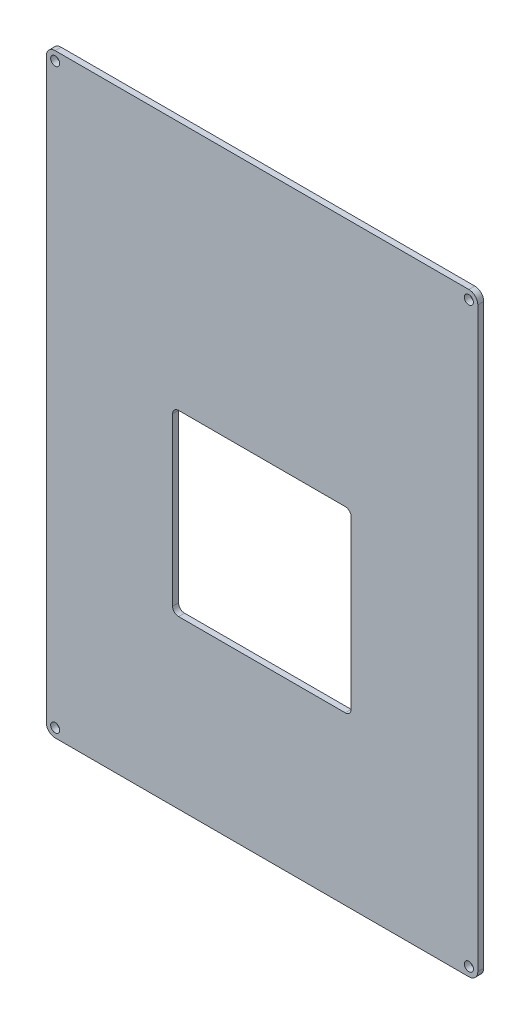
ISO-10303-21;
HEADER;
FILE_DESCRIPTION(('STEP AP214'),'2;1');
FILE_NAME('part.step','',(''),(''),'','','');
FILE_SCHEMA(('AUTOMOTIVE_DESIGN { 1 0 10303 214 1 1 1 1 }'));
ENDSEC;
DATA;
#1=APPLICATION_CONTEXT('core data for automotive mechanical design processes');
#2=APPLICATION_PROTOCOL_DEFINITION('international standard','automotive_design',2000,#1);
#3=PRODUCT_CONTEXT('',#1,'mechanical');
#4=PRODUCT('Part','Part','',(#3));
#5=PRODUCT_RELATED_PRODUCT_CATEGORY('part','',(#4));
#6=PRODUCT_DEFINITION_FORMATION('','',#4);
#7=PRODUCT_DEFINITION_CONTEXT('part definition',#1,'design');
#8=PRODUCT_DEFINITION('design','',#6,#7);
#9=PRODUCT_DEFINITION_SHAPE('','',#8);
#10=(LENGTH_UNIT() NAMED_UNIT(*) SI_UNIT(.MILLI.,.METRE.));
#11=(NAMED_UNIT(*) PLANE_ANGLE_UNIT() SI_UNIT($,.RADIAN.));
#12=(NAMED_UNIT(*) SI_UNIT($,.STERADIAN.) SOLID_ANGLE_UNIT());
#13=UNCERTAINTY_MEASURE_WITH_UNIT(LENGTH_MEASURE(1.E-05),#10,'distance_accuracy_value','');
#14=(GEOMETRIC_REPRESENTATION_CONTEXT(3) GLOBAL_UNCERTAINTY_ASSIGNED_CONTEXT((#13)) GLOBAL_UNIT_ASSIGNED_CONTEXT((#10,
#11,#12)) REPRESENTATION_CONTEXT('',''));
#15=CARTESIAN_POINT('',(0.,0.,0.));
#16=DIRECTION('',(0.,0.,1.));
#17=DIRECTION('',(1.,0.,0.));
#18=AXIS2_PLACEMENT_3D('',#15,#16,#17);
#19=CARTESIAN_POINT('',(-69.5,-94.5,2.));
#20=DIRECTION('',(0.,0.,-1.));
#21=DIRECTION('',(-1.,0.,0.));
#22=AXIS2_PLACEMENT_3D('',#19,#20,#21);
#23=CYLINDRICAL_SURFACE('',#22,3.);
#24=CARTESIAN_POINT('',(-69.5,-94.5,0.));
#25=DIRECTION('',(0.,0.,1.));
#26=DIRECTION('',(-1.,0.,0.));
#27=AXIS2_PLACEMENT_3D('',#24,#25,#26);
#28=CIRCLE('',#27,3.);
#29=CARTESIAN_POINT('',(-72.5,-94.5,0.));
#30=VERTEX_POINT('',#29);
#31=CARTESIAN_POINT('',(-69.5,-97.5,0.));
#32=VERTEX_POINT('',#31);
#33=EDGE_CURVE('E230',#30,#32,#28,.T.);
#34=ORIENTED_EDGE('',*,*,#33,.T.);
#35=DIRECTION('',(0.,0.,-1.));
#36=VECTOR('',#35,1.);
#37=CARTESIAN_POINT('',(-69.5,-97.5,2.));
#38=LINE('',#37,#36);
#39=CARTESIAN_POINT('',(-69.5,-97.5,2.));
#40=VERTEX_POINT('',#39);
#41=EDGE_CURVE('E11',#40,#32,#38,.T.);
#42=ORIENTED_EDGE('',*,*,#41,.F.);
#43=CARTESIAN_POINT('',(-69.5,-94.5,2.));
#44=DIRECTION('',(0.,0.,1.));
#45=DIRECTION('',(-1.,0.,0.));
#46=AXIS2_PLACEMENT_3D('',#43,#44,#45);
#47=CIRCLE('',#46,3.);
#48=CARTESIAN_POINT('',(-72.5,-94.5,2.));
#49=VERTEX_POINT('',#48);
#50=EDGE_CURVE('E231',#49,#40,#47,.T.);
#51=ORIENTED_EDGE('',*,*,#50,.F.);
#52=DIRECTION('',(0.,0.,-1.));
#53=VECTOR('',#52,1.);
#54=CARTESIAN_POINT('',(-72.5,-94.5,2.));
#55=LINE('',#54,#53);
#56=EDGE_CURVE('E254',#49,#30,#55,.T.);
#57=ORIENTED_EDGE('',*,*,#56,.T.);
#58=EDGE_LOOP('',(#34,#42,#51,#57));
#59=FACE_BOUND('',#58,.T.);
#60=ADVANCED_FACE('F39',(#59),#23,.T.);
#61=CARTESIAN_POINT('',(-69.5,-97.5,2.));
#62=DIRECTION('',(0.,1.,0.));
#63=DIRECTION('',(0.,0.,1.));
#64=AXIS2_PLACEMENT_3D('',#61,#62,#63);
#65=PLANE('',#64);
#66=DIRECTION('',(1.,0.,0.));
#67=VECTOR('',#66,1.);
#68=CARTESIAN_POINT('',(-69.5,-97.5,0.));
#69=LINE('',#68,#67);
#70=CARTESIAN_POINT('',(69.5,-97.5,0.));
#71=VERTEX_POINT('',#70);
#72=EDGE_CURVE('E258',#32,#71,#69,.T.);
#73=ORIENTED_EDGE('',*,*,#72,.T.);
#74=DIRECTION('',(0.,0.,-1.));
#75=VECTOR('',#74,1.);
#76=CARTESIAN_POINT('',(69.5,-97.5,2.));
#77=LINE('',#76,#75);
#78=CARTESIAN_POINT('',(69.5,-97.5,2.));
#79=VERTEX_POINT('',#78);
#80=EDGE_CURVE('E48',#79,#71,#77,.T.);
#81=ORIENTED_EDGE('',*,*,#80,.F.);
#82=DIRECTION('',(1.,0.,0.));
#83=VECTOR('',#82,1.);
#84=CARTESIAN_POINT('',(-69.5,-97.5,2.));
#85=LINE('',#84,#83);
#86=EDGE_CURVE('E235',#40,#79,#85,.T.);
#87=ORIENTED_EDGE('',*,*,#86,.F.);
#88=ORIENTED_EDGE('',*,*,#41,.T.);
#89=EDGE_LOOP('',(#73,#81,#87,#88));
#90=FACE_BOUND('',#89,.T.);
#91=ADVANCED_FACE('F345',(#90),#65,.F.);
#92=CARTESIAN_POINT('',(69.5,-94.5,2.));
#93=DIRECTION('',(0.,0.,-1.));
#94=DIRECTION('',(-1.,0.,0.));
#95=AXIS2_PLACEMENT_3D('',#92,#93,#94);
#96=CYLINDRICAL_SURFACE('',#95,3.);
#97=CARTESIAN_POINT('',(69.5,-94.5,0.));
#98=DIRECTION('',(0.,0.,1.));
#99=DIRECTION('',(1.,0.,0.));
#100=AXIS2_PLACEMENT_3D('',#97,#98,#99);
#101=CIRCLE('',#100,3.);
#102=CARTESIAN_POINT('',(72.5,-94.5,0.));
#103=VERTEX_POINT('',#102);
#104=EDGE_CURVE('E261',#71,#103,#101,.T.);
#105=ORIENTED_EDGE('',*,*,#104,.T.);
#106=DIRECTION('',(0.,0.,-1.));
#107=VECTOR('',#106,1.);
#108=CARTESIAN_POINT('',(72.5,-94.5,2.));
#109=LINE('',#108,#107);
#110=CARTESIAN_POINT('',(72.5,-94.5,2.));
#111=VERTEX_POINT('',#110);
#112=EDGE_CURVE('E291',#111,#103,#109,.T.);
#113=ORIENTED_EDGE('',*,*,#112,.F.);
#114=CARTESIAN_POINT('',(69.5,-94.5,2.));
#115=DIRECTION('',(0.,0.,1.));
#116=DIRECTION('',(1.,0.,0.));
#117=AXIS2_PLACEMENT_3D('',#114,#115,#116);
#118=CIRCLE('',#117,3.);
#119=EDGE_CURVE('E239',#79,#111,#118,.T.);
#120=ORIENTED_EDGE('',*,*,#119,.F.);
#121=ORIENTED_EDGE('',*,*,#80,.T.);
#122=EDGE_LOOP('',(#105,#113,#120,#121));
#123=FACE_BOUND('',#122,.T.);
#124=ADVANCED_FACE('F350',(#123),#96,.T.);
#125=CARTESIAN_POINT('',(72.5,-94.5,2.));
#126=DIRECTION('',(-1.,0.,0.));
#127=DIRECTION('',(0.,0.,1.));
#128=AXIS2_PLACEMENT_3D('',#125,#126,#127);
#129=PLANE('',#128);
#130=DIRECTION('',(0.,1.,0.));
#131=VECTOR('',#130,1.);
#132=CARTESIAN_POINT('',(72.5,-94.5,0.));
#133=LINE('',#132,#131);
#134=CARTESIAN_POINT('',(72.5,99.5,0.));
#135=VERTEX_POINT('',#134);
#136=EDGE_CURVE('E263',#103,#135,#133,.T.);
#137=ORIENTED_EDGE('',*,*,#136,.T.);
#138=DIRECTION('',(0.,0.,-1.));
#139=VECTOR('',#138,1.);
#140=CARTESIAN_POINT('',(72.5,99.5,2.));
#141=LINE('',#140,#139);
#142=CARTESIAN_POINT('',(72.5,99.5,2.));
#143=VERTEX_POINT('',#142);
#144=EDGE_CURVE('E288',#143,#135,#141,.T.);
#145=ORIENTED_EDGE('',*,*,#144,.F.);
#146=DIRECTION('',(0.,1.,0.));
#147=VECTOR('',#146,1.);
#148=CARTESIAN_POINT('',(72.5,-94.5,2.));
#149=LINE('',#148,#147);
#150=EDGE_CURVE('E241',#111,#143,#149,.T.);
#151=ORIENTED_EDGE('',*,*,#150,.F.);
#152=ORIENTED_EDGE('',*,*,#112,.T.);
#153=EDGE_LOOP('',(#137,#145,#151,#152));
#154=FACE_BOUND('',#153,.T.);
#155=ADVANCED_FACE('F356',(#154),#129,.F.);
#156=CARTESIAN_POINT('',(69.5,99.5,2.));
#157=DIRECTION('',(0.,0.,-1.));
#158=DIRECTION('',(-1.,0.,0.));
#159=AXIS2_PLACEMENT_3D('',#156,#157,#158);
#160=CYLINDRICAL_SURFACE('',#159,3.00000000000001);
#161=CARTESIAN_POINT('',(69.5,99.5,0.));
#162=DIRECTION('',(0.,0.,1.));
#163=DIRECTION('',(-1.,0.,0.));
#164=AXIS2_PLACEMENT_3D('',#161,#162,#163);
#165=CIRCLE('',#164,3.00000000000001);
#166=CARTESIAN_POINT('',(69.5,102.5,0.));
#167=VERTEX_POINT('',#166);
#168=EDGE_CURVE('E265',#135,#167,#165,.T.);
#169=ORIENTED_EDGE('',*,*,#168,.T.);
#170=DIRECTION('',(0.,0.,-1.));
#171=VECTOR('',#170,1.);
#172=CARTESIAN_POINT('',(69.5,102.5,2.));
#173=LINE('',#172,#171);
#174=CARTESIAN_POINT('',(69.5,102.5,2.));
#175=VERTEX_POINT('',#174);
#176=EDGE_CURVE('E285',#175,#167,#173,.T.);
#177=ORIENTED_EDGE('',*,*,#176,.F.);
#178=CARTESIAN_POINT('',(69.5,99.5,2.));
#179=DIRECTION('',(0.,0.,1.));
#180=DIRECTION('',(-1.,0.,0.));
#181=AXIS2_PLACEMENT_3D('',#178,#179,#180);
#182=CIRCLE('',#181,3.00000000000001);
#183=EDGE_CURVE('E243',#143,#175,#182,.T.);
#184=ORIENTED_EDGE('',*,*,#183,.F.);
#185=ORIENTED_EDGE('',*,*,#144,.T.);
#186=EDGE_LOOP('',(#169,#177,#184,#185));
#187=FACE_BOUND('',#186,.T.);
#188=ADVANCED_FACE('F360',(#187),#160,.T.);
#189=CARTESIAN_POINT('',(-69.5,102.5,2.));
#190=DIRECTION('',(0.,-1.,0.));
#191=DIRECTION('',(0.,0.,-1.));
#192=AXIS2_PLACEMENT_3D('',#189,#190,#191);
#193=PLANE('',#192);
#194=DIRECTION('',(-1.,0.,0.));
#195=VECTOR('',#194,1.);
#196=CARTESIAN_POINT('',(-69.5,102.5,0.));
#197=LINE('',#196,#195);
#198=CARTESIAN_POINT('',(-69.5,102.5,0.));
#199=VERTEX_POINT('',#198);
#200=EDGE_CURVE('E267',#167,#199,#197,.T.);
#201=ORIENTED_EDGE('',*,*,#200,.T.);
#202=DIRECTION('',(0.,0.,-1.));
#203=VECTOR('',#202,1.);
#204=CARTESIAN_POINT('',(-69.5,102.5,2.));
#205=LINE('',#204,#203);
#206=CARTESIAN_POINT('',(-69.5,102.5,2.));
#207=VERTEX_POINT('',#206);
#208=EDGE_CURVE('E281',#207,#199,#205,.T.);
#209=ORIENTED_EDGE('',*,*,#208,.F.);
#210=DIRECTION('',(-1.,0.,0.));
#211=VECTOR('',#210,1.);
#212=CARTESIAN_POINT('',(-69.5,102.5,2.));
#213=LINE('',#212,#211);
#214=EDGE_CURVE('E245',#175,#207,#213,.T.);
#215=ORIENTED_EDGE('',*,*,#214,.F.);
#216=ORIENTED_EDGE('',*,*,#176,.T.);
#217=EDGE_LOOP('',(#201,#209,#215,#216));
#218=FACE_BOUND('',#217,.T.);
#219=ADVANCED_FACE('F365',(#218),#193,.F.);
#220=CARTESIAN_POINT('',(-69.5,99.5,2.));
#221=DIRECTION('',(0.,0.,-1.));
#222=DIRECTION('',(-1.,0.,0.));
#223=AXIS2_PLACEMENT_3D('',#220,#221,#222);
#224=CYLINDRICAL_SURFACE('',#223,3.);
#225=CARTESIAN_POINT('',(-69.5,99.5,0.));
#226=DIRECTION('',(0.,0.,1.));
#227=DIRECTION('',(-1.,0.,0.));
#228=AXIS2_PLACEMENT_3D('',#225,#226,#227);
#229=CIRCLE('',#228,3.);
#230=CARTESIAN_POINT('',(-72.5,99.5,0.));
#231=VERTEX_POINT('',#230);
#232=EDGE_CURVE('E270',#199,#231,#229,.T.);
#233=ORIENTED_EDGE('',*,*,#232,.T.);
#234=DIRECTION('',(0.,0.,-1.));
#235=VECTOR('',#234,1.);
#236=CARTESIAN_POINT('',(-72.5,99.5,2.));
#237=LINE('',#236,#235);
#238=CARTESIAN_POINT('',(-72.5,99.5,2.));
#239=VERTEX_POINT('',#238);
#240=EDGE_CURVE('E277',#239,#231,#237,.T.);
#241=ORIENTED_EDGE('',*,*,#240,.F.);
#242=CARTESIAN_POINT('',(-69.5,99.5,2.));
#243=DIRECTION('',(0.,0.,1.));
#244=DIRECTION('',(-1.,0.,0.));
#245=AXIS2_PLACEMENT_3D('',#242,#243,#244);
#246=CIRCLE('',#245,3.);
#247=EDGE_CURVE('E248',#207,#239,#246,.T.);
#248=ORIENTED_EDGE('',*,*,#247,.F.);
#249=ORIENTED_EDGE('',*,*,#208,.T.);
#250=EDGE_LOOP('',(#233,#241,#248,#249));
#251=FACE_BOUND('',#250,.T.);
#252=ADVANCED_FACE('F369',(#251),#224,.T.);
#253=CARTESIAN_POINT('',(-72.5,-94.5,2.));
#254=DIRECTION('',(1.,0.,0.));
#255=DIRECTION('',(0.,0.,-1.));
#256=AXIS2_PLACEMENT_3D('',#253,#254,#255);
#257=PLANE('',#256);
#258=DIRECTION('',(0.,-1.,0.));
#259=VECTOR('',#258,1.);
#260=CARTESIAN_POINT('',(-72.5,-94.5,0.));
#261=LINE('',#260,#259);
#262=EDGE_CURVE('E236',#231,#30,#261,.T.);
#263=ORIENTED_EDGE('',*,*,#262,.T.);
#264=ORIENTED_EDGE('',*,*,#56,.F.);
#265=DIRECTION('',(0.,-1.,0.));
#266=VECTOR('',#265,1.);
#267=CARTESIAN_POINT('',(-72.5,-94.5,2.));
#268=LINE('',#267,#266);
#269=EDGE_CURVE('E251',#239,#49,#268,.T.);
#270=ORIENTED_EDGE('',*,*,#269,.F.);
#271=ORIENTED_EDGE('',*,*,#240,.T.);
#272=EDGE_LOOP('',(#263,#264,#270,#271));
#273=FACE_BOUND('',#272,.T.);
#274=ADVANCED_FACE('F331',(#273),#257,.F.);
#275=CARTESIAN_POINT('',(-69.5,-94.5,2.));
#276=DIRECTION('',(0.,0.,-1.));
#277=DIRECTION('',(-1.,0.,0.));
#278=AXIS2_PLACEMENT_3D('',#275,#276,#277);
#279=PLANE('',#278);
#280=CARTESIAN_POINT('',(69.5,-94.5,2.));
#281=DIRECTION('',(0.,0.,1.));
#282=DIRECTION('',(1.,0.,0.));
#283=AXIS2_PLACEMENT_3D('',#280,#281,#282);
#284=CIRCLE('',#283,1.51999999999999);
#285=CARTESIAN_POINT('',(71.02,-94.5,2.));
#286=VERTEX_POINT('',#285);
#287=EDGE_CURVE('E316',#286,#286,#284,.T.);
#288=ORIENTED_EDGE('',*,*,#287,.F.);
#289=EDGE_LOOP('',(#288));
#290=FACE_BOUND('',#289,.T.);
#291=CARTESIAN_POINT('',(-69.5,-94.5,2.));
#292=DIRECTION('',(0.,0.,1.));
#293=DIRECTION('',(1.,0.,0.));
#294=AXIS2_PLACEMENT_3D('',#291,#292,#293);
#295=CIRCLE('',#294,1.51999999999999);
#296=CARTESIAN_POINT('',(-67.98,-94.5,2.));
#297=VERTEX_POINT('',#296);
#298=EDGE_CURVE('E319',#297,#297,#295,.T.);
#299=ORIENTED_EDGE('',*,*,#298,.F.);
#300=EDGE_LOOP('',(#299));
#301=FACE_BOUND('',#300,.T.);
#302=CARTESIAN_POINT('',(-69.5,99.5,2.));
#303=DIRECTION('',(0.,0.,1.));
#304=DIRECTION('',(1.,0.,0.));
#305=AXIS2_PLACEMENT_3D('',#302,#303,#304);
#306=CIRCLE('',#305,1.51999999999999);
#307=CARTESIAN_POINT('',(-67.98,99.5,2.));
#308=VERTEX_POINT('',#307);
#309=EDGE_CURVE('E315',#308,#308,#306,.T.);
#310=ORIENTED_EDGE('',*,*,#309,.F.);
#311=EDGE_LOOP('',(#310));
#312=FACE_BOUND('',#311,.T.);
#313=CARTESIAN_POINT('',(69.5,99.5,2.));
#314=DIRECTION('',(0.,0.,1.));
#315=DIRECTION('',(1.,0.,0.));
#316=AXIS2_PLACEMENT_3D('',#313,#314,#315);
#317=CIRCLE('',#316,1.51999999999999);
#318=CARTESIAN_POINT('',(71.02,99.5,2.));
#319=VERTEX_POINT('',#318);
#320=EDGE_CURVE('E300',#319,#319,#317,.T.);
#321=ORIENTED_EDGE('',*,*,#320,.F.);
#322=EDGE_LOOP('',(#321));
#323=FACE_BOUND('',#322,.T.);
#324=DIRECTION('',(0.,-1.,0.));
#325=VECTOR('',#324,1.);
#326=CARTESIAN_POINT('',(29.9456070107022,-94.5,2.));
#327=LINE('',#326,#325);
#328=CARTESIAN_POINT('',(29.9456070107022,16.5504674140006,2.));
#329=VERTEX_POINT('',#328);
#330=CARTESIAN_POINT('',(29.9456070107022,-39.4495325859993,2.));
#331=VERTEX_POINT('',#330);
#332=EDGE_CURVE('E224',#329,#331,#327,.T.);
#333=ORIENTED_EDGE('',*,*,#332,.T.);
#334=CARTESIAN_POINT('',(27.9456070107022,-39.4495325859993,2.));
#335=DIRECTION('',(0.,0.,-1.));
#336=DIRECTION('',(-1.,0.,0.));
#337=AXIS2_PLACEMENT_3D('',#334,#335,#336);
#338=CIRCLE('',#337,2.);
#339=CARTESIAN_POINT('',(27.9456070107022,-41.4495325859993,2.));
#340=VERTEX_POINT('',#339);
#341=EDGE_CURVE('E227',#331,#340,#338,.T.);
#342=ORIENTED_EDGE('',*,*,#341,.T.);
#343=DIRECTION('',(-1.,0.,0.));
#344=VECTOR('',#343,1.);
#345=CARTESIAN_POINT('',(-69.5,-41.4495325859993,2.));
#346=LINE('',#345,#344);
#347=CARTESIAN_POINT('',(-28.0543929892978,-41.4495325859993,2.));
#348=VERTEX_POINT('',#347);
#349=EDGE_CURVE('E199',#340,#348,#346,.T.);
#350=ORIENTED_EDGE('',*,*,#349,.T.);
#351=CARTESIAN_POINT('',(-28.0543929892978,-39.4495325859993,2.));
#352=DIRECTION('',(0.,0.,-1.));
#353=DIRECTION('',(-1.,0.,0.));
#354=AXIS2_PLACEMENT_3D('',#351,#352,#353);
#355=CIRCLE('',#354,2.);
#356=CARTESIAN_POINT('',(-30.0543929892978,-39.4495325859993,2.));
#357=VERTEX_POINT('',#356);
#358=EDGE_CURVE('E166',#348,#357,#355,.T.);
#359=ORIENTED_EDGE('',*,*,#358,.T.);
#360=DIRECTION('',(0.,1.,0.));
#361=VECTOR('',#360,1.);
#362=CARTESIAN_POINT('',(-30.0543929892978,-94.5,2.));
#363=LINE('',#362,#361);
#364=CARTESIAN_POINT('',(-30.0543929892978,16.5504674140006,2.));
#365=VERTEX_POINT('',#364);
#366=EDGE_CURVE('E212',#357,#365,#363,.T.);
#367=ORIENTED_EDGE('',*,*,#366,.T.);
#368=CARTESIAN_POINT('',(-28.0543929892978,16.5504674140007,2.));
#369=DIRECTION('',(0.,0.,-1.));
#370=DIRECTION('',(-1.,0.,0.));
#371=AXIS2_PLACEMENT_3D('',#368,#369,#370);
#372=CIRCLE('',#371,2.);
#373=CARTESIAN_POINT('',(-28.0543929892978,18.5504674140007,2.));
#374=VERTEX_POINT('',#373);
#375=EDGE_CURVE('E215',#365,#374,#372,.T.);
#376=ORIENTED_EDGE('',*,*,#375,.T.);
#377=DIRECTION('',(1.,0.,0.));
#378=VECTOR('',#377,1.);
#379=CARTESIAN_POINT('',(-69.5,18.5504674140007,2.));
#380=LINE('',#379,#378);
#381=CARTESIAN_POINT('',(27.9456070107022,18.5504674140007,2.));
#382=VERTEX_POINT('',#381);
#383=EDGE_CURVE('E218',#374,#382,#380,.T.);
#384=ORIENTED_EDGE('',*,*,#383,.T.);
#385=CARTESIAN_POINT('',(27.9456070107022,16.5504674140007,2.));
#386=DIRECTION('',(0.,0.,-1.));
#387=DIRECTION('',(-1.,0.,0.));
#388=AXIS2_PLACEMENT_3D('',#385,#386,#387);
#389=CIRCLE('',#388,2.);
#390=EDGE_CURVE('E221',#382,#329,#389,.T.);
#391=ORIENTED_EDGE('',*,*,#390,.T.);
#392=EDGE_LOOP('',(#333,#342,#350,#359,#367,#376,#384,#391));
#393=FACE_BOUND('',#392,.T.);
#394=ORIENTED_EDGE('',*,*,#50,.T.);
#395=ORIENTED_EDGE('',*,*,#86,.T.);
#396=ORIENTED_EDGE('',*,*,#119,.T.);
#397=ORIENTED_EDGE('',*,*,#150,.T.);
#398=ORIENTED_EDGE('',*,*,#183,.T.);
#399=ORIENTED_EDGE('',*,*,#214,.T.);
#400=ORIENTED_EDGE('',*,*,#247,.T.);
#401=ORIENTED_EDGE('',*,*,#269,.T.);
#402=EDGE_LOOP('',(#394,#395,#396,#397,#398,#399,#400,#401));
#403=FACE_BOUND('',#402,.T.);
#404=ADVANCED_FACE('F328',(#290,#301,#312,#323,#393,#403),#279,.F.);
#405=CARTESIAN_POINT('',(-69.5,-94.5,0.));
#406=DIRECTION('',(0.,0.,-1.));
#407=DIRECTION('',(-1.,0.,0.));
#408=AXIS2_PLACEMENT_3D('',#405,#406,#407);
#409=PLANE('',#408);
#410=CARTESIAN_POINT('',(69.5,-94.5,0.));
#411=DIRECTION('',(0.,0.,-1.));
#412=DIRECTION('',(-1.,0.,0.));
#413=AXIS2_PLACEMENT_3D('',#410,#411,#412);
#414=CIRCLE('',#413,1.51999999999999);
#415=CARTESIAN_POINT('',(67.98,-94.5,0.));
#416=VERTEX_POINT('',#415);
#417=EDGE_CURVE('E42',#416,#416,#414,.T.);
#418=ORIENTED_EDGE('',*,*,#417,.F.);
#419=EDGE_LOOP('',(#418));
#420=FACE_BOUND('',#419,.T.);
#421=CARTESIAN_POINT('',(-69.5,-94.5,0.));
#422=DIRECTION('',(0.,0.,-1.));
#423=DIRECTION('',(-1.,0.,0.));
#424=AXIS2_PLACEMENT_3D('',#421,#422,#423);
#425=CIRCLE('',#424,1.51999999999999);
#426=CARTESIAN_POINT('',(-71.02,-94.5,0.));
#427=VERTEX_POINT('',#426);
#428=EDGE_CURVE('E303',#427,#427,#425,.T.);
#429=ORIENTED_EDGE('',*,*,#428,.F.);
#430=EDGE_LOOP('',(#429));
#431=FACE_BOUND('',#430,.T.);
#432=CARTESIAN_POINT('',(-69.5,99.5,0.));
#433=DIRECTION('',(0.,0.,-1.));
#434=DIRECTION('',(-1.,0.,0.));
#435=AXIS2_PLACEMENT_3D('',#432,#433,#434);
#436=CIRCLE('',#435,1.51999999999999);
#437=CARTESIAN_POINT('',(-71.02,99.5,0.));
#438=VERTEX_POINT('',#437);
#439=EDGE_CURVE('E299',#438,#438,#436,.T.);
#440=ORIENTED_EDGE('',*,*,#439,.F.);
#441=EDGE_LOOP('',(#440));
#442=FACE_BOUND('',#441,.T.);
#443=CARTESIAN_POINT('',(69.5,99.5,0.));
#444=DIRECTION('',(0.,0.,-1.));
#445=DIRECTION('',(-1.,0.,0.));
#446=AXIS2_PLACEMENT_3D('',#443,#444,#445);
#447=CIRCLE('',#446,1.51999999999999);
#448=CARTESIAN_POINT('',(67.98,99.5,0.));
#449=VERTEX_POINT('',#448);
#450=EDGE_CURVE('E296',#449,#449,#447,.T.);
#451=ORIENTED_EDGE('',*,*,#450,.F.);
#452=EDGE_LOOP('',(#451));
#453=FACE_BOUND('',#452,.T.);
#454=CARTESIAN_POINT('',(27.9456070107022,-39.4495325859993,0.));
#455=DIRECTION('',(0.,0.,-1.));
#456=DIRECTION('',(1.,0.,0.));
#457=AXIS2_PLACEMENT_3D('',#454,#455,#456);
#458=CIRCLE('',#457,2.);
#459=CARTESIAN_POINT('',(29.9456070107022,-39.4495325859993,0.));
#460=VERTEX_POINT('',#459);
#461=CARTESIAN_POINT('',(27.9456070107022,-41.4495325859993,0.));
#462=VERTEX_POINT('',#461);
#463=EDGE_CURVE('E64',#460,#462,#458,.T.);
#464=ORIENTED_EDGE('',*,*,#463,.F.);
#465=DIRECTION('',(0.,-1.,0.));
#466=VECTOR('',#465,1.);
#467=CARTESIAN_POINT('',(29.9456070107022,-39.4495325859993,0.));
#468=LINE('',#467,#466);
#469=CARTESIAN_POINT('',(29.9456070107022,16.5504674140006,0.));
#470=VERTEX_POINT('',#469);
#471=EDGE_CURVE('E194',#470,#460,#468,.T.);
#472=ORIENTED_EDGE('',*,*,#471,.F.);
#473=CARTESIAN_POINT('',(27.9456070107022,16.5504674140007,0.));
#474=DIRECTION('',(0.,0.,-1.));
#475=DIRECTION('',(1.,0.,0.));
#476=AXIS2_PLACEMENT_3D('',#473,#474,#475);
#477=CIRCLE('',#476,2.);
#478=CARTESIAN_POINT('',(27.9456070107022,18.5504674140007,0.));
#479=VERTEX_POINT('',#478);
#480=EDGE_CURVE('E191',#479,#470,#477,.T.);
#481=ORIENTED_EDGE('',*,*,#480,.F.);
#482=DIRECTION('',(1.,0.,0.));
#483=VECTOR('',#482,1.);
#484=CARTESIAN_POINT('',(27.9456070107022,18.5504674140007,0.));
#485=LINE('',#484,#483);
#486=CARTESIAN_POINT('',(-28.0543929892978,18.5504674140007,0.));
#487=VERTEX_POINT('',#486);
#488=EDGE_CURVE('E188',#487,#479,#485,.T.);
#489=ORIENTED_EDGE('',*,*,#488,.F.);
#490=CARTESIAN_POINT('',(-28.0543929892978,16.5504674140007,0.));
#491=DIRECTION('',(0.,0.,-1.));
#492=DIRECTION('',(1.,0.,0.));
#493=AXIS2_PLACEMENT_3D('',#490,#491,#492);
#494=CIRCLE('',#493,2.);
#495=CARTESIAN_POINT('',(-30.0543929892978,16.5504674140006,0.));
#496=VERTEX_POINT('',#495);
#497=EDGE_CURVE('E182',#496,#487,#494,.T.);
#498=ORIENTED_EDGE('',*,*,#497,.F.);
#499=DIRECTION('',(0.,1.,0.));
#500=VECTOR('',#499,1.);
#501=CARTESIAN_POINT('',(-30.0543929892978,-39.4495325859993,0.));
#502=LINE('',#501,#500);
#503=CARTESIAN_POINT('',(-30.0543929892978,-39.4495325859993,0.));
#504=VERTEX_POINT('',#503);
#505=EDGE_CURVE('E180',#504,#496,#502,.T.);
#506=ORIENTED_EDGE('',*,*,#505,.F.);
#507=CARTESIAN_POINT('',(-28.0543929892978,-39.4495325859993,0.));
#508=DIRECTION('',(0.,0.,-1.));
#509=DIRECTION('',(-1.,0.,0.));
#510=AXIS2_PLACEMENT_3D('',#507,#508,#509);
#511=CIRCLE('',#510,2.);
#512=CARTESIAN_POINT('',(-28.0543929892978,-41.4495325859993,0.));
#513=VERTEX_POINT('',#512);
#514=EDGE_CURVE('E163',#513,#504,#511,.T.);
#515=ORIENTED_EDGE('',*,*,#514,.F.);
#516=DIRECTION('',(-1.,0.,0.));
#517=VECTOR('',#516,1.);
#518=CARTESIAN_POINT('',(27.9456070107022,-41.4495325859993,0.));
#519=LINE('',#518,#517);
#520=EDGE_CURVE('E172',#462,#513,#519,.T.);
#521=ORIENTED_EDGE('',*,*,#520,.F.);
#522=EDGE_LOOP('',(#464,#472,#481,#489,#498,#506,#515,#521));
#523=FACE_BOUND('',#522,.T.);
#524=ORIENTED_EDGE('',*,*,#33,.F.);
#525=ORIENTED_EDGE('',*,*,#262,.F.);
#526=ORIENTED_EDGE('',*,*,#232,.F.);
#527=ORIENTED_EDGE('',*,*,#200,.F.);
#528=ORIENTED_EDGE('',*,*,#168,.F.);
#529=ORIENTED_EDGE('',*,*,#136,.F.);
#530=ORIENTED_EDGE('',*,*,#104,.F.);
#531=ORIENTED_EDGE('',*,*,#72,.F.);
#532=EDGE_LOOP('',(#524,#525,#526,#527,#528,#529,#530,#531));
#533=FACE_BOUND('',#532,.T.);
#534=ADVANCED_FACE('F176',(#420,#431,#442,#453,#523,#533),#409,.T.);
#535=CARTESIAN_POINT('',(27.9456070107022,-39.4495325859993,10.));
#536=DIRECTION('',(0.,0.,-1.));
#537=DIRECTION('',(-1.,0.,0.));
#538=AXIS2_PLACEMENT_3D('',#535,#536,#537);
#539=CYLINDRICAL_SURFACE('',#538,2.);
#540=DIRECTION('',(0.,0.,-1.));
#541=VECTOR('',#540,1.);
#542=CARTESIAN_POINT('',(29.9456070107022,-39.4495325859993,10.));
#543=LINE('',#542,#541);
#544=EDGE_CURVE('E197',#331,#460,#543,.T.);
#545=ORIENTED_EDGE('',*,*,#544,.T.);
#546=ORIENTED_EDGE('',*,*,#463,.T.);
#547=DIRECTION('',(0.,0.,-1.));
#548=VECTOR('',#547,1.);
#549=CARTESIAN_POINT('',(27.9456070107022,-41.4495325859993,10.));
#550=LINE('',#549,#548);
#551=EDGE_CURVE('E169',#340,#462,#550,.T.);
#552=ORIENTED_EDGE('',*,*,#551,.F.);
#553=ORIENTED_EDGE('',*,*,#341,.F.);
#554=EDGE_LOOP('',(#545,#546,#552,#553));
#555=FACE_BOUND('',#554,.T.);
#556=ADVANCED_FACE('F374',(#555),#539,.F.);
#557=CARTESIAN_POINT('',(29.9456070107022,-39.4495325859993,10.));
#558=DIRECTION('',(1.,0.,0.));
#559=DIRECTION('',(0.,0.,-1.));
#560=AXIS2_PLACEMENT_3D('',#557,#558,#559);
#561=PLANE('',#560);
#562=DIRECTION('',(0.,0.,-1.));
#563=VECTOR('',#562,1.);
#564=CARTESIAN_POINT('',(29.9456070107022,16.5504674140006,10.));
#565=LINE('',#564,#563);
#566=EDGE_CURVE('E200',#329,#470,#565,.T.);
#567=ORIENTED_EDGE('',*,*,#566,.T.);
#568=ORIENTED_EDGE('',*,*,#471,.T.);
#569=ORIENTED_EDGE('',*,*,#544,.F.);
#570=ORIENTED_EDGE('',*,*,#332,.F.);
#571=EDGE_LOOP('',(#567,#568,#569,#570));
#572=FACE_BOUND('',#571,.T.);
#573=ADVANCED_FACE('F379',(#572),#561,.F.);
#574=CARTESIAN_POINT('',(27.9456070107022,16.5504674140007,10.));
#575=DIRECTION('',(0.,0.,-1.));
#576=DIRECTION('',(-1.,0.,0.));
#577=AXIS2_PLACEMENT_3D('',#574,#575,#576);
#578=CYLINDRICAL_SURFACE('',#577,2.);
#579=DIRECTION('',(0.,0.,-1.));
#580=VECTOR('',#579,1.);
#581=CARTESIAN_POINT('',(27.9456070107022,18.5504674140007,10.));
#582=LINE('',#581,#580);
#583=EDGE_CURVE('E202',#382,#479,#582,.T.);
#584=ORIENTED_EDGE('',*,*,#583,.T.);
#585=ORIENTED_EDGE('',*,*,#480,.T.);
#586=ORIENTED_EDGE('',*,*,#566,.F.);
#587=ORIENTED_EDGE('',*,*,#390,.F.);
#588=EDGE_LOOP('',(#584,#585,#586,#587));
#589=FACE_BOUND('',#588,.T.);
#590=ADVANCED_FACE('F429',(#589),#578,.F.);
#591=CARTESIAN_POINT('',(27.9456070107022,18.5504674140007,10.));
#592=DIRECTION('',(0.,1.,0.));
#593=DIRECTION('',(0.,0.,1.));
#594=AXIS2_PLACEMENT_3D('',#591,#592,#593);
#595=PLANE('',#594);
#596=DIRECTION('',(0.,0.,-1.));
#597=VECTOR('',#596,1.);
#598=CARTESIAN_POINT('',(-28.0543929892978,18.5504674140007,10.));
#599=LINE('',#598,#597);
#600=EDGE_CURVE('E204',#374,#487,#599,.T.);
#601=ORIENTED_EDGE('',*,*,#600,.T.);
#602=ORIENTED_EDGE('',*,*,#488,.T.);
#603=ORIENTED_EDGE('',*,*,#583,.F.);
#604=ORIENTED_EDGE('',*,*,#383,.F.);
#605=EDGE_LOOP('',(#601,#602,#603,#604));
#606=FACE_BOUND('',#605,.T.);
#607=ADVANCED_FACE('F437',(#606),#595,.F.);
#608=CARTESIAN_POINT('',(-28.0543929892978,16.5504674140007,10.));
#609=DIRECTION('',(0.,0.,-1.));
#610=DIRECTION('',(-1.,0.,0.));
#611=AXIS2_PLACEMENT_3D('',#608,#609,#610);
#612=CYLINDRICAL_SURFACE('',#611,2.);
#613=DIRECTION('',(0.,0.,-1.));
#614=VECTOR('',#613,1.);
#615=CARTESIAN_POINT('',(-30.0543929892978,16.5504674140006,10.));
#616=LINE('',#615,#614);
#617=EDGE_CURVE('E206',#365,#496,#616,.T.);
#618=ORIENTED_EDGE('',*,*,#617,.T.);
#619=ORIENTED_EDGE('',*,*,#497,.T.);
#620=ORIENTED_EDGE('',*,*,#600,.F.);
#621=ORIENTED_EDGE('',*,*,#375,.F.);
#622=EDGE_LOOP('',(#618,#619,#620,#621));
#623=FACE_BOUND('',#622,.T.);
#624=ADVANCED_FACE('F445',(#623),#612,.F.);
#625=CARTESIAN_POINT('',(-30.0543929892978,-39.4495325859993,10.));
#626=DIRECTION('',(-1.,0.,0.));
#627=DIRECTION('',(0.,0.,1.));
#628=AXIS2_PLACEMENT_3D('',#625,#626,#627);
#629=PLANE('',#628);
#630=DIRECTION('',(0.,0.,-1.));
#631=VECTOR('',#630,1.);
#632=CARTESIAN_POINT('',(-30.0543929892978,-39.4495325859993,10.));
#633=LINE('',#632,#631);
#634=EDGE_CURVE('E168',#357,#504,#633,.T.);
#635=ORIENTED_EDGE('',*,*,#634,.T.);
#636=ORIENTED_EDGE('',*,*,#505,.T.);
#637=ORIENTED_EDGE('',*,*,#617,.F.);
#638=ORIENTED_EDGE('',*,*,#366,.F.);
#639=EDGE_LOOP('',(#635,#636,#637,#638));
#640=FACE_BOUND('',#639,.T.);
#641=ADVANCED_FACE('F453',(#640),#629,.F.);
#642=CARTESIAN_POINT('',(-28.0543929892978,-39.4495325859993,10.));
#643=DIRECTION('',(0.,0.,-1.));
#644=DIRECTION('',(-1.,0.,0.));
#645=AXIS2_PLACEMENT_3D('',#642,#643,#644);
#646=CYLINDRICAL_SURFACE('',#645,2.);
#647=DIRECTION('',(0.,0.,-1.));
#648=VECTOR('',#647,1.);
#649=CARTESIAN_POINT('',(-28.0543929892978,-41.4495325859993,10.));
#650=LINE('',#649,#648);
#651=EDGE_CURVE('E56',#348,#513,#650,.T.);
#652=ORIENTED_EDGE('',*,*,#651,.T.);
#653=ORIENTED_EDGE('',*,*,#514,.T.);
#654=ORIENTED_EDGE('',*,*,#634,.F.);
#655=ORIENTED_EDGE('',*,*,#358,.F.);
#656=EDGE_LOOP('',(#652,#653,#654,#655));
#657=FACE_BOUND('',#656,.T.);
#658=ADVANCED_FACE('F160',(#657),#646,.F.);
#659=CARTESIAN_POINT('',(27.9456070107022,-41.4495325859993,10.));
#660=DIRECTION('',(0.,-1.,0.));
#661=DIRECTION('',(0.,0.,-1.));
#662=AXIS2_PLACEMENT_3D('',#659,#660,#661);
#663=PLANE('',#662);
#664=ORIENTED_EDGE('',*,*,#551,.T.);
#665=ORIENTED_EDGE('',*,*,#520,.T.);
#666=ORIENTED_EDGE('',*,*,#651,.F.);
#667=ORIENTED_EDGE('',*,*,#349,.F.);
#668=EDGE_LOOP('',(#664,#665,#666,#667));
#669=FACE_BOUND('',#668,.T.);
#670=ADVANCED_FACE('F173',(#669),#663,.F.);
#671=CARTESIAN_POINT('',(69.5,99.5,-8.));
#672=DIRECTION('',(0.,0.,1.));
#673=DIRECTION('',(1.,0.,0.));
#674=AXIS2_PLACEMENT_3D('',#671,#672,#673);
#675=CYLINDRICAL_SURFACE('',#674,1.51999999999999);
#676=ORIENTED_EDGE('',*,*,#450,.T.);
#677=EDGE_LOOP('',(#676));
#678=FACE_BOUND('',#677,.T.);
#679=ORIENTED_EDGE('',*,*,#320,.T.);
#680=EDGE_LOOP('',(#679));
#681=FACE_BOUND('',#680,.T.);
#682=ADVANCED_FACE('F473',(#678,#681),#675,.F.);
#683=CARTESIAN_POINT('',(-69.5,99.5,-8.));
#684=DIRECTION('',(0.,0.,1.));
#685=DIRECTION('',(1.,0.,0.));
#686=AXIS2_PLACEMENT_3D('',#683,#684,#685);
#687=CYLINDRICAL_SURFACE('',#686,1.51999999999999);
#688=ORIENTED_EDGE('',*,*,#439,.T.);
#689=EDGE_LOOP('',(#688));
#690=FACE_BOUND('',#689,.T.);
#691=ORIENTED_EDGE('',*,*,#309,.T.);
#692=EDGE_LOOP('',(#691));
#693=FACE_BOUND('',#692,.T.);
#694=ADVANCED_FACE('F326',(#690,#693),#687,.F.);
#695=CARTESIAN_POINT('',(-69.5,-94.5,-8.));
#696=DIRECTION('',(0.,0.,1.));
#697=DIRECTION('',(1.,0.,0.));
#698=AXIS2_PLACEMENT_3D('',#695,#696,#697);
#699=CYLINDRICAL_SURFACE('',#698,1.51999999999999);
#700=ORIENTED_EDGE('',*,*,#428,.T.);
#701=EDGE_LOOP('',(#700));
#702=FACE_BOUND('',#701,.T.);
#703=ORIENTED_EDGE('',*,*,#298,.T.);
#704=EDGE_LOOP('',(#703));
#705=FACE_BOUND('',#704,.T.);
#706=ADVANCED_FACE('F486',(#702,#705),#699,.F.);
#707=CARTESIAN_POINT('',(69.5,-94.5,-8.));
#708=DIRECTION('',(0.,0.,1.));
#709=DIRECTION('',(1.,0.,0.));
#710=AXIS2_PLACEMENT_3D('',#707,#708,#709);
#711=CYLINDRICAL_SURFACE('',#710,1.51999999999999);
#712=ORIENTED_EDGE('',*,*,#417,.T.);
#713=EDGE_LOOP('',(#712));
#714=FACE_BOUND('',#713,.T.);
#715=ORIENTED_EDGE('',*,*,#287,.T.);
#716=EDGE_LOOP('',(#715));
#717=FACE_BOUND('',#716,.T.);
#718=ADVANCED_FACE('F494',(#714,#717),#711,.F.);
#719=CLOSED_SHELL('',(#60,#91,#124,#155,#188,#219,#252,#274,#404,#534,#556,#573,#590,#607,#624,
#641,#658,#670,#682,#694,#706,#718));
#720=MANIFOLD_SOLID_BREP('B2',#719);
#721=ADVANCED_BREP_SHAPE_REPRESENTATION('',(#18,#720),#14);
#722=SHAPE_DEFINITION_REPRESENTATION(#9,#721);
ENDSEC;
END-ISO-10303-21;
